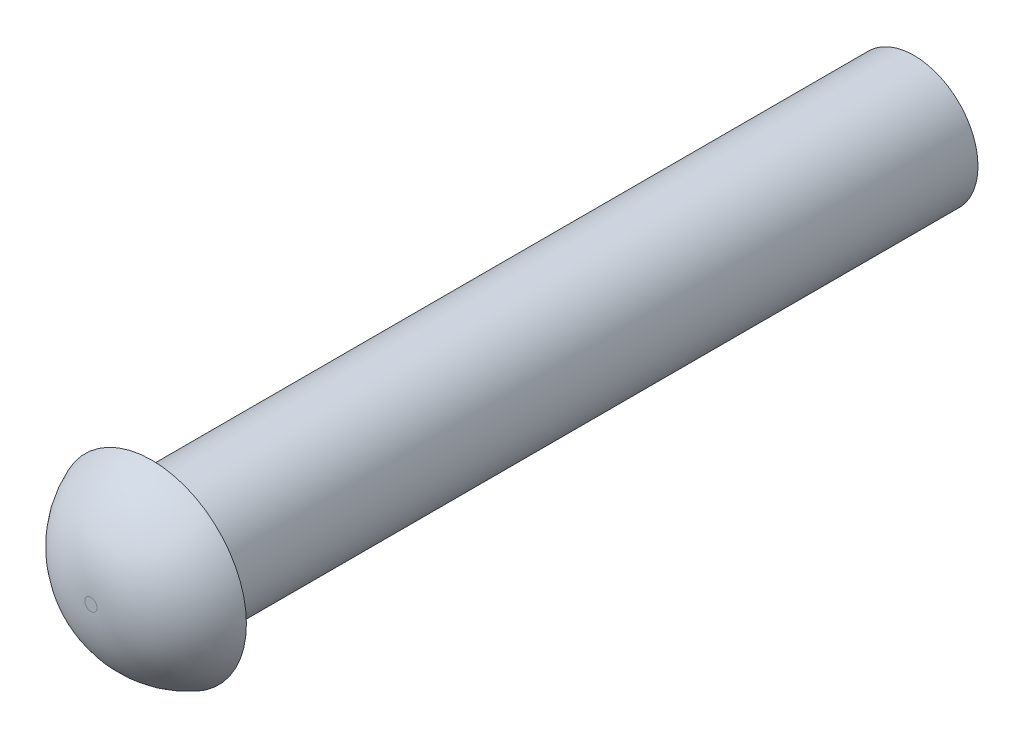
ISO-10303-21;
HEADER;
FILE_DESCRIPTION(('STEP AP214'),'2;1');
FILE_NAME('part.step','',(''),(''),'','','');
FILE_SCHEMA(('AUTOMOTIVE_DESIGN { 1 0 10303 214 1 1 1 1 }'));
ENDSEC;
DATA;
#1=APPLICATION_CONTEXT('core data for automotive mechanical design processes');
#2=APPLICATION_PROTOCOL_DEFINITION('international standard','automotive_design',2000,#1);
#3=PRODUCT_CONTEXT('',#1,'mechanical');
#4=PRODUCT('Part','Part','',(#3));
#5=PRODUCT_RELATED_PRODUCT_CATEGORY('part','',(#4));
#6=PRODUCT_DEFINITION_FORMATION('','',#4);
#7=PRODUCT_DEFINITION_CONTEXT('part definition',#1,'design');
#8=PRODUCT_DEFINITION('design','',#6,#7);
#9=PRODUCT_DEFINITION_SHAPE('','',#8);
#10=(LENGTH_UNIT() NAMED_UNIT(*) SI_UNIT(.MILLI.,.METRE.));
#11=(NAMED_UNIT(*) PLANE_ANGLE_UNIT() SI_UNIT($,.RADIAN.));
#12=(NAMED_UNIT(*) SI_UNIT($,.STERADIAN.) SOLID_ANGLE_UNIT());
#13=UNCERTAINTY_MEASURE_WITH_UNIT(LENGTH_MEASURE(1.E-05),#10,'distance_accuracy_value','');
#14=(GEOMETRIC_REPRESENTATION_CONTEXT(3) GLOBAL_UNCERTAINTY_ASSIGNED_CONTEXT((#13)) GLOBAL_UNIT_ASSIGNED_CONTEXT((#10,
#11,#12)) REPRESENTATION_CONTEXT('',''));
#15=CARTESIAN_POINT('',(0.,0.,0.));
#16=DIRECTION('',(0.,0.,1.));
#17=DIRECTION('',(1.,0.,0.));
#18=AXIS2_PLACEMENT_3D('',#15,#16,#17);
#19=CARTESIAN_POINT('',(0.,0.,-6.));
#20=DIRECTION('',(0.,0.,1.));
#21=DIRECTION('',(1.,0.,0.));
#22=AXIS2_PLACEMENT_3D('',#19,#20,#21);
#23=CYLINDRICAL_SURFACE('',#22,1.05);
#24=CARTESIAN_POINT('',(0.,0.,-6.));
#25=DIRECTION('',(0.,0.,1.));
#26=DIRECTION('',(1.,0.,0.));
#27=AXIS2_PLACEMENT_3D('',#24,#25,#26);
#28=CIRCLE('',#27,1.05);
#29=CARTESIAN_POINT('',(1.05,0.,-6.));
#30=VERTEX_POINT('',#29);
#31=EDGE_CURVE('E51',#30,#30,#28,.T.);
#32=ORIENTED_EDGE('',*,*,#31,.T.);
#33=EDGE_LOOP('',(#32));
#34=FACE_BOUND('',#33,.T.);
#35=CARTESIAN_POINT('',(0.,0.,6.5));
#36=DIRECTION('',(0.,0.,1.));
#37=DIRECTION('',(1.,0.,0.));
#38=AXIS2_PLACEMENT_3D('',#35,#36,#37);
#39=CIRCLE('',#38,1.05);
#40=CARTESIAN_POINT('',(1.05,0.,6.5));
#41=VERTEX_POINT('',#40);
#42=EDGE_CURVE('E56',#41,#41,#39,.T.);
#43=ORIENTED_EDGE('',*,*,#42,.F.);
#44=EDGE_LOOP('',(#43));
#45=FACE_BOUND('',#44,.T.);
#46=ADVANCED_FACE('F43',(#34,#45),#23,.T.);
#47=CARTESIAN_POINT('',(0.,0.,-6.));
#48=DIRECTION('',(0.,0.,1.));
#49=DIRECTION('',(1.,0.,0.));
#50=AXIS2_PLACEMENT_3D('',#47,#48,#49);
#51=PLANE('',#50);
#52=ORIENTED_EDGE('',*,*,#31,.F.);
#53=EDGE_LOOP('',(#52));
#54=FACE_BOUND('',#53,.T.);
#55=ADVANCED_FACE('F80',(#54),#51,.F.);
#56=CARTESIAN_POINT('',(0.,0.,7.5));
#57=DIRECTION('',(0.,0.,1.));
#58=DIRECTION('',(1.,0.,0.));
#59=AXIS2_PLACEMENT_3D('',#56,#57,#58);
#60=PLANE('',#59);
#61=CARTESIAN_POINT('',(0.,0.,7.5));
#62=DIRECTION('',(0.,0.,1.));
#63=DIRECTION('',(1.,0.,0.));
#64=AXIS2_PLACEMENT_3D('',#61,#62,#63);
#65=CIRCLE('',#64,0.100862325381056);
#66=CARTESIAN_POINT('',(0.100862325381056,0.,7.5));
#67=VERTEX_POINT('',#66);
#68=EDGE_CURVE('E10',#67,#67,#65,.T.);
#69=ORIENTED_EDGE('',*,*,#68,.T.);
#70=EDGE_LOOP('',(#69));
#71=FACE_BOUND('',#70,.T.);
#72=ADVANCED_FACE('F72',(#71),#60,.T.);
#73=CARTESIAN_POINT('',(0.,0.,6.5));
#74=DIRECTION('',(0.,0.,1.));
#75=DIRECTION('',(1.,0.,0.));
#76=AXIS2_PLACEMENT_3D('',#73,#74,#75);
#77=PLANE('',#76);
#78=ORIENTED_EDGE('',*,*,#42,.T.);
#79=EDGE_LOOP('',(#78));
#80=FACE_BOUND('',#79,.T.);
#81=CARTESIAN_POINT('',(0.,0.,6.5));
#82=DIRECTION('',(0.,0.,1.));
#83=DIRECTION('',(1.,0.,0.));
#84=AXIS2_PLACEMENT_3D('',#81,#82,#83);
#85=CIRCLE('',#84,1.55);
#86=CARTESIAN_POINT('',(1.55,0.,6.5));
#87=VERTEX_POINT('',#86);
#88=EDGE_CURVE('E61',#87,#87,#85,.T.);
#89=ORIENTED_EDGE('',*,*,#88,.F.);
#90=EDGE_LOOP('',(#89));
#91=FACE_BOUND('',#90,.T.);
#92=ADVANCED_FACE('F70',(#80,#91),#77,.F.);
#93=CARTESIAN_POINT('',(0.,0.,5.95));
#94=DIRECTION('',(0.,0.,-1.));
#95=DIRECTION('',(-1.,0.,0.));
#96=AXIS2_PLACEMENT_3D('',#93,#94,#95);
#97=DEGENERATE_TOROIDAL_SURFACE('',#96,0.100862325381056,1.55,.T.);
#98=ORIENTED_EDGE('',*,*,#88,.T.);
#99=EDGE_LOOP('',(#98));
#100=FACE_BOUND('',#99,.T.);
#101=ORIENTED_EDGE('',*,*,#68,.F.);
#102=EDGE_LOOP('',(#101));
#103=FACE_BOUND('',#102,.T.);
#104=ADVANCED_FACE('F45',(#100,#103),#97,.T.);
#105=CLOSED_SHELL('',(#46,#55,#72,#92,#104));
#106=MANIFOLD_SOLID_BREP('B2',#105);
#107=ADVANCED_BREP_SHAPE_REPRESENTATION('',(#18,#106),#14);
#108=SHAPE_DEFINITION_REPRESENTATION(#9,#107);
ENDSEC;
END-ISO-10303-21;
